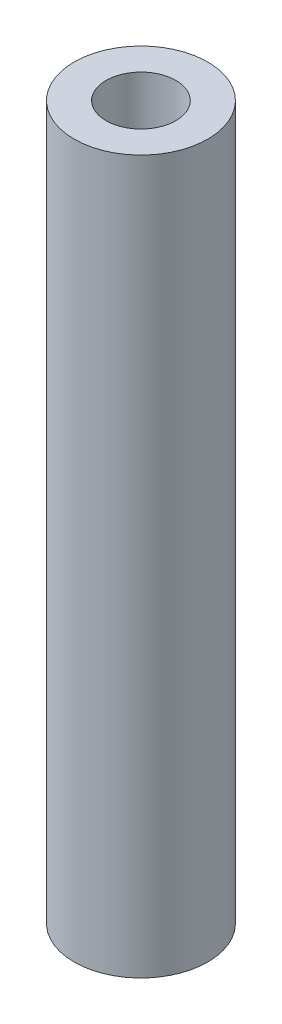
ISO-10303-21;
HEADER;
FILE_DESCRIPTION(('STEP AP214'),'2;1');
FILE_NAME('part.step','',(''),(''),'','','');
FILE_SCHEMA(('AUTOMOTIVE_DESIGN { 1 0 10303 214 1 1 1 1 }'));
ENDSEC;
DATA;
#1=APPLICATION_CONTEXT('core data for automotive mechanical design processes');
#2=APPLICATION_PROTOCOL_DEFINITION('international standard','automotive_design',2000,#1);
#3=PRODUCT_CONTEXT('',#1,'mechanical');
#4=PRODUCT('Part','Part','',(#3));
#5=PRODUCT_RELATED_PRODUCT_CATEGORY('part','',(#4));
#6=PRODUCT_DEFINITION_FORMATION('','',#4);
#7=PRODUCT_DEFINITION_CONTEXT('part definition',#1,'design');
#8=PRODUCT_DEFINITION('design','',#6,#7);
#9=PRODUCT_DEFINITION_SHAPE('','',#8);
#10=(LENGTH_UNIT() NAMED_UNIT(*) SI_UNIT(.MILLI.,.METRE.));
#11=(NAMED_UNIT(*) PLANE_ANGLE_UNIT() SI_UNIT($,.RADIAN.));
#12=(NAMED_UNIT(*) SI_UNIT($,.STERADIAN.) SOLID_ANGLE_UNIT());
#13=UNCERTAINTY_MEASURE_WITH_UNIT(LENGTH_MEASURE(1.E-05),#10,'distance_accuracy_value','');
#14=(GEOMETRIC_REPRESENTATION_CONTEXT(3) GLOBAL_UNCERTAINTY_ASSIGNED_CONTEXT((#13)) GLOBAL_UNIT_ASSIGNED_CONTEXT((#10,
#11,#12)) REPRESENTATION_CONTEXT('',''));
#15=CARTESIAN_POINT('',(0.,0.,0.));
#16=DIRECTION('',(0.,0.,1.));
#17=DIRECTION('',(1.,0.,0.));
#18=AXIS2_PLACEMENT_3D('',#15,#16,#17);
#19=CARTESIAN_POINT('',(-102.921960951703,50.8,7.48228899175507));
#20=DIRECTION('',(0.,1.,0.));
#21=DIRECTION('',(0.,0.,1.));
#22=AXIS2_PLACEMENT_3D('',#19,#20,#21);
#23=PLANE('',#22);
#24=CARTESIAN_POINT('',(-102.921960951703,50.8,7.48228899175507));
#25=DIRECTION('',(0.,1.,0.));
#26=DIRECTION('',(0.,0.,1.));
#27=AXIS2_PLACEMENT_3D('',#24,#25,#26);
#28=CIRCLE('',#27,4.7625);
#29=CARTESIAN_POINT('',(-102.921960951703,50.8,12.2447889917551));
#30=VERTEX_POINT('',#29);
#31=EDGE_CURVE('E10',#30,#30,#28,.T.);
#32=ORIENTED_EDGE('',*,*,#31,.T.);
#33=EDGE_LOOP('',(#32));
#34=FACE_BOUND('',#33,.T.);
#35=CARTESIAN_POINT('',(-102.921960951703,50.8,7.48228899175507));
#36=DIRECTION('',(0.,1.,0.));
#37=DIRECTION('',(0.,0.,1.));
#38=AXIS2_PLACEMENT_3D('',#35,#36,#37);
#39=CIRCLE('',#38,2.48920000000002);
#40=CARTESIAN_POINT('',(-102.921960951703,50.8,9.97148899175509));
#41=VERTEX_POINT('',#40);
#42=EDGE_CURVE('E48',#41,#41,#39,.T.);
#43=ORIENTED_EDGE('',*,*,#42,.F.);
#44=EDGE_LOOP('',(#43));
#45=FACE_BOUND('',#44,.T.);
#46=ADVANCED_FACE('F37',(#34,#45),#23,.T.);
#47=CARTESIAN_POINT('',(-102.921960951703,0.,7.48228899175507));
#48=DIRECTION('',(0.,1.,0.));
#49=DIRECTION('',(0.,0.,1.));
#50=AXIS2_PLACEMENT_3D('',#47,#48,#49);
#51=PLANE('',#50);
#52=CARTESIAN_POINT('',(-102.921960951703,0.,7.48228899175507));
#53=DIRECTION('',(0.,1.,0.));
#54=DIRECTION('',(0.,0.,1.));
#55=AXIS2_PLACEMENT_3D('',#52,#53,#54);
#56=CIRCLE('',#55,4.7625);
#57=CARTESIAN_POINT('',(-102.921960951703,0.,12.2447889917551));
#58=VERTEX_POINT('',#57);
#59=EDGE_CURVE('E41',#58,#58,#56,.T.);
#60=ORIENTED_EDGE('',*,*,#59,.F.);
#61=EDGE_LOOP('',(#60));
#62=FACE_BOUND('',#61,.T.);
#63=CARTESIAN_POINT('',(-102.921960951703,0.,7.48228899175507));
#64=DIRECTION('',(0.,1.,0.));
#65=DIRECTION('',(0.,0.,1.));
#66=AXIS2_PLACEMENT_3D('',#63,#64,#65);
#67=CIRCLE('',#66,2.48920000000002);
#68=CARTESIAN_POINT('',(-102.921960951703,0.,9.97148899175509));
#69=VERTEX_POINT('',#68);
#70=EDGE_CURVE('E50',#69,#69,#67,.T.);
#71=ORIENTED_EDGE('',*,*,#70,.T.);
#72=EDGE_LOOP('',(#71));
#73=FACE_BOUND('',#72,.T.);
#74=ADVANCED_FACE('F60',(#62,#73),#51,.F.);
#75=CARTESIAN_POINT('',(-102.921960951703,50.8,7.48228899175507));
#76=DIRECTION('',(0.,-1.,0.));
#77=DIRECTION('',(0.,0.,-1.));
#78=AXIS2_PLACEMENT_3D('',#75,#76,#77);
#79=CYLINDRICAL_SURFACE('',#78,4.7625);
#80=ORIENTED_EDGE('',*,*,#31,.F.);
#81=EDGE_LOOP('',(#80));
#82=FACE_BOUND('',#81,.T.);
#83=ORIENTED_EDGE('',*,*,#59,.T.);
#84=EDGE_LOOP('',(#83));
#85=FACE_BOUND('',#84,.T.);
#86=ADVANCED_FACE('F39',(#82,#85),#79,.T.);
#87=CARTESIAN_POINT('',(-102.921960951703,50.8,7.48228899175507));
#88=DIRECTION('',(0.,-1.,0.));
#89=DIRECTION('',(0.,0.,-1.));
#90=AXIS2_PLACEMENT_3D('',#87,#88,#89);
#91=CYLINDRICAL_SURFACE('',#90,2.48920000000002);
#92=ORIENTED_EDGE('',*,*,#42,.T.);
#93=EDGE_LOOP('',(#92));
#94=FACE_BOUND('',#93,.T.);
#95=ORIENTED_EDGE('',*,*,#70,.F.);
#96=EDGE_LOOP('',(#95));
#97=FACE_BOUND('',#96,.T.);
#98=ADVANCED_FACE('F56',(#94,#97),#91,.F.);
#99=CLOSED_SHELL('',(#46,#74,#86,#98));
#100=MANIFOLD_SOLID_BREP('B2',#99);
#101=ADVANCED_BREP_SHAPE_REPRESENTATION('',(#18,#100),#14);
#102=SHAPE_DEFINITION_REPRESENTATION(#9,#101);
ENDSEC;
END-ISO-10303-21;
